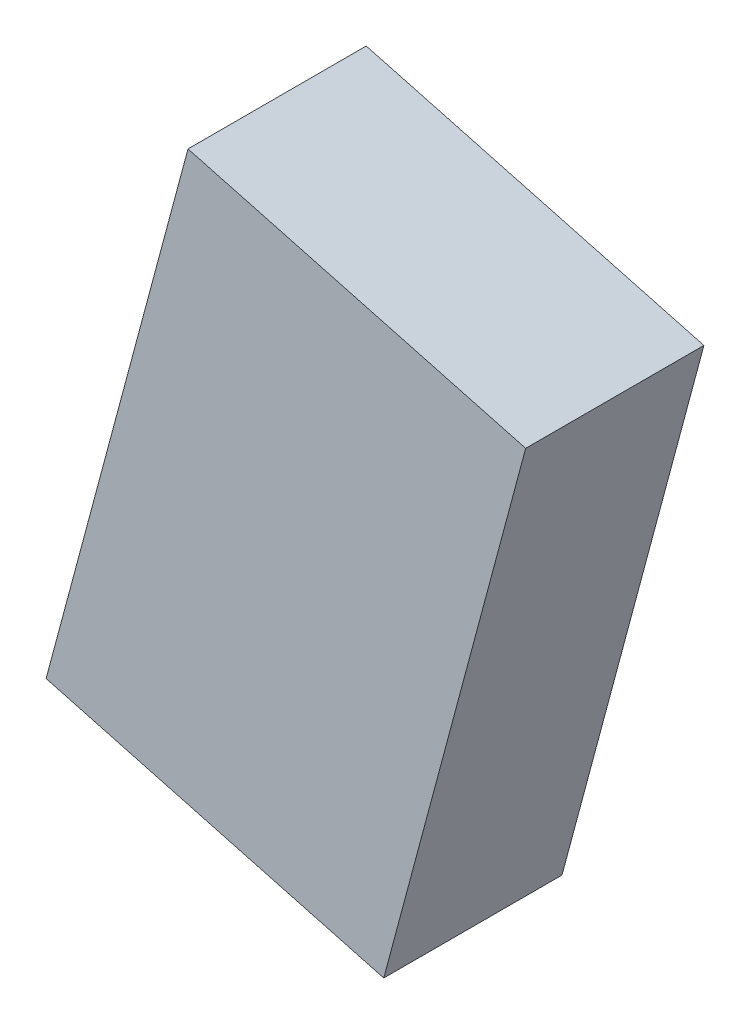
ISO-10303-21;
HEADER;
FILE_DESCRIPTION(('STEP AP214'),'2;1');
FILE_NAME('part.step','',(''),(''),'','','');
FILE_SCHEMA(('AUTOMOTIVE_DESIGN { 1 0 10303 214 1 1 1 1 }'));
ENDSEC;
DATA;
#1=APPLICATION_CONTEXT('core data for automotive mechanical design processes');
#2=APPLICATION_PROTOCOL_DEFINITION('international standard','automotive_design',2000,#1);
#3=PRODUCT_CONTEXT('',#1,'mechanical');
#4=PRODUCT('Part','Part','',(#3));
#5=PRODUCT_RELATED_PRODUCT_CATEGORY('part','',(#4));
#6=PRODUCT_DEFINITION_FORMATION('','',#4);
#7=PRODUCT_DEFINITION_CONTEXT('part definition',#1,'design');
#8=PRODUCT_DEFINITION('design','',#6,#7);
#9=PRODUCT_DEFINITION_SHAPE('','',#8);
#10=(LENGTH_UNIT() NAMED_UNIT(*) SI_UNIT(.MILLI.,.METRE.));
#11=(NAMED_UNIT(*) PLANE_ANGLE_UNIT() SI_UNIT($,.RADIAN.));
#12=(NAMED_UNIT(*) SI_UNIT($,.STERADIAN.) SOLID_ANGLE_UNIT());
#13=UNCERTAINTY_MEASURE_WITH_UNIT(LENGTH_MEASURE(1.E-05),#10,'distance_accuracy_value','');
#14=(GEOMETRIC_REPRESENTATION_CONTEXT(3) GLOBAL_UNCERTAINTY_ASSIGNED_CONTEXT((#13)) GLOBAL_UNIT_ASSIGNED_CONTEXT((#10,
#11,#12)) REPRESENTATION_CONTEXT('',''));
#15=CARTESIAN_POINT('',(0.,0.,0.));
#16=DIRECTION('',(0.,0.,1.));
#17=DIRECTION('',(1.,0.,0.));
#18=AXIS2_PLACEMENT_3D('',#15,#16,#17);
#19=CARTESIAN_POINT('',(27.726237173534,-151.4199194331,121.1));
#20=DIRECTION('',(0.,0.,1.));
#21=DIRECTION('',(1.,0.,0.));
#22=AXIS2_PLACEMENT_3D('',#19,#20,#21);
#23=PLANE('',#22);
#24=DIRECTION('',(-0.96592885755583,0.258807731995954,0.));
#25=VECTOR('',#24,1.);
#26=CARTESIAN_POINT('',(27.726237173534,-151.4199194331,121.1));
#27=LINE('',#26,#25);
#28=CARTESIAN_POINT('',(27.726237173534,-151.4199194331,121.1));
#29=VERTEX_POINT('',#28);
#30=CARTESIAN_POINT('',(17.873762826466,-148.7800805668,121.1));
#31=VERTEX_POINT('',#30);
#32=EDGE_CURVE('E72',#29,#31,#27,.T.);
#33=ORIENTED_EDGE('',*,*,#32,.F.);
#34=DIRECTION('',(0.258807731995954,0.96592885755583,0.));
#35=VECTOR('',#34,1.);
#36=CARTESIAN_POINT('',(27.726237173534,-151.4199194331,121.1));
#37=LINE('',#36,#35);
#38=CARTESIAN_POINT('',(31.867160885478,-135.9650577122,121.1));
#39=VERTEX_POINT('',#38);
#40=EDGE_CURVE('E66',#29,#39,#37,.T.);
#41=ORIENTED_EDGE('',*,*,#40,.T.);
#42=DIRECTION('',(-0.96592885755583,0.258807731995954,0.));
#43=VECTOR('',#42,1.);
#44=CARTESIAN_POINT('',(31.867160885478,-135.9650577122,121.1));
#45=LINE('',#44,#43);
#46=CARTESIAN_POINT('',(22.01468653841,-133.3252188459,121.1));
#47=VERTEX_POINT('',#46);
#48=EDGE_CURVE('E68',#39,#47,#45,.T.);
#49=ORIENTED_EDGE('',*,*,#48,.T.);
#50=DIRECTION('',(0.258807731995954,0.96592885755583,0.));
#51=VECTOR('',#50,1.);
#52=CARTESIAN_POINT('',(17.873762826466,-148.7800805668,121.1));
#53=LINE('',#52,#51);
#54=EDGE_CURVE('E10',#31,#47,#53,.T.);
#55=ORIENTED_EDGE('',*,*,#54,.F.);
#56=EDGE_LOOP('',(#33,#41,#49,#55));
#57=FACE_BOUND('',#56,.T.);
#58=ADVANCED_FACE('F15',(#57),#23,.T.);
#59=CARTESIAN_POINT('',(27.726237173534,-151.4199194331,115.9));
#60=DIRECTION('',(0.,0.,1.));
#61=DIRECTION('',(1.,0.,0.));
#62=AXIS2_PLACEMENT_3D('',#59,#60,#61);
#63=PLANE('',#62);
#64=DIRECTION('',(0.258807731995954,0.96592885755583,0.));
#65=VECTOR('',#64,1.);
#66=CARTESIAN_POINT('',(17.873762826466,-148.7800805668,115.9));
#67=LINE('',#66,#65);
#68=CARTESIAN_POINT('',(17.873762826466,-148.7800805668,115.9));
#69=VERTEX_POINT('',#68);
#70=CARTESIAN_POINT('',(22.01468653841,-133.3252188459,115.9));
#71=VERTEX_POINT('',#70);
#72=EDGE_CURVE('E26',#69,#71,#67,.T.);
#73=ORIENTED_EDGE('',*,*,#72,.T.);
#74=DIRECTION('',(-0.96592885755583,0.258807731995954,0.));
#75=VECTOR('',#74,1.);
#76=CARTESIAN_POINT('',(31.867160885478,-135.9650577122,115.9));
#77=LINE('',#76,#75);
#78=CARTESIAN_POINT('',(31.867160885478,-135.9650577122,115.9));
#79=VERTEX_POINT('',#78);
#80=EDGE_CURVE('E86',#79,#71,#77,.T.);
#81=ORIENTED_EDGE('',*,*,#80,.F.);
#82=DIRECTION('',(0.258807731995954,0.96592885755583,0.));
#83=VECTOR('',#82,1.);
#84=CARTESIAN_POINT('',(27.726237173534,-151.4199194331,115.9));
#85=LINE('',#84,#83);
#86=CARTESIAN_POINT('',(27.726237173534,-151.4199194331,115.9));
#87=VERTEX_POINT('',#86);
#88=EDGE_CURVE('E58',#87,#79,#85,.T.);
#89=ORIENTED_EDGE('',*,*,#88,.F.);
#90=DIRECTION('',(-0.96592885755583,0.258807731995954,0.));
#91=VECTOR('',#90,1.);
#92=CARTESIAN_POINT('',(27.726237173534,-151.4199194331,115.9));
#93=LINE('',#92,#91);
#94=EDGE_CURVE('E19',#87,#69,#93,.T.);
#95=ORIENTED_EDGE('',*,*,#94,.T.);
#96=EDGE_LOOP('',(#73,#81,#89,#95));
#97=FACE_BOUND('',#96,.T.);
#98=ADVANCED_FACE('F123',(#97),#63,.F.);
#99=CARTESIAN_POINT('',(17.873762826466,-148.7800805668,115.9));
#100=DIRECTION('',(-0.96592885755583,0.258807731995954,0.));
#101=DIRECTION('',(0.,0.,1.));
#102=AXIS2_PLACEMENT_3D('',#99,#100,#101);
#103=PLANE('',#102);
#104=ORIENTED_EDGE('',*,*,#72,.F.);
#105=DIRECTION('',(0.,0.,1.));
#106=VECTOR('',#105,1.);
#107=CARTESIAN_POINT('',(17.873762826466,-148.7800805668,115.9));
#108=LINE('',#107,#106);
#109=EDGE_CURVE('E95',#69,#31,#108,.T.);
#110=ORIENTED_EDGE('',*,*,#109,.T.);
#111=ORIENTED_EDGE('',*,*,#54,.T.);
#112=DIRECTION('',(0.,0.,1.));
#113=VECTOR('',#112,1.);
#114=CARTESIAN_POINT('',(22.01468653841,-133.3252188459,115.9));
#115=LINE('',#114,#113);
#116=EDGE_CURVE('E81',#71,#47,#115,.T.);
#117=ORIENTED_EDGE('',*,*,#116,.F.);
#118=EDGE_LOOP('',(#104,#110,#111,#117));
#119=FACE_BOUND('',#118,.T.);
#120=ADVANCED_FACE('F17',(#119),#103,.T.);
#121=CARTESIAN_POINT('',(27.726237173534,-151.4199194331,115.9));
#122=DIRECTION('',(-0.96592885755583,0.258807731995954,0.));
#123=DIRECTION('',(0.,0.,1.));
#124=AXIS2_PLACEMENT_3D('',#121,#122,#123);
#125=PLANE('',#124);
#126=DIRECTION('',(0.,0.,1.));
#127=VECTOR('',#126,1.);
#128=CARTESIAN_POINT('',(31.867160885478,-135.9650577122,115.9));
#129=LINE('',#128,#127);
#130=EDGE_CURVE('E80',#79,#39,#129,.T.);
#131=ORIENTED_EDGE('',*,*,#130,.T.);
#132=ORIENTED_EDGE('',*,*,#40,.F.);
#133=DIRECTION('',(0.,0.,1.));
#134=VECTOR('',#133,1.);
#135=CARTESIAN_POINT('',(27.726237173534,-151.4199194331,115.9));
#136=LINE('',#135,#134);
#137=EDGE_CURVE('E87',#87,#29,#136,.T.);
#138=ORIENTED_EDGE('',*,*,#137,.F.);
#139=ORIENTED_EDGE('',*,*,#88,.T.);
#140=EDGE_LOOP('',(#131,#132,#138,#139));
#141=FACE_BOUND('',#140,.T.);
#142=ADVANCED_FACE('F84',(#141),#125,.F.);
#143=CARTESIAN_POINT('',(31.867160885478,-135.9650577122,115.9));
#144=DIRECTION('',(0.258807731995954,0.96592885755583,0.));
#145=DIRECTION('',(0.,0.,-1.));
#146=AXIS2_PLACEMENT_3D('',#143,#144,#145);
#147=PLANE('',#146);
#148=ORIENTED_EDGE('',*,*,#130,.F.);
#149=ORIENTED_EDGE('',*,*,#80,.T.);
#150=ORIENTED_EDGE('',*,*,#116,.T.);
#151=ORIENTED_EDGE('',*,*,#48,.F.);
#152=EDGE_LOOP('',(#148,#149,#150,#151));
#153=FACE_BOUND('',#152,.T.);
#154=ADVANCED_FACE('F78',(#153),#147,.T.);
#155=CARTESIAN_POINT('',(27.726237173534,-151.4199194331,115.9));
#156=DIRECTION('',(0.258807731995954,0.96592885755583,0.));
#157=DIRECTION('',(0.,0.,-1.));
#158=AXIS2_PLACEMENT_3D('',#155,#156,#157);
#159=PLANE('',#158);
#160=ORIENTED_EDGE('',*,*,#32,.T.);
#161=ORIENTED_EDGE('',*,*,#109,.F.);
#162=ORIENTED_EDGE('',*,*,#94,.F.);
#163=ORIENTED_EDGE('',*,*,#137,.T.);
#164=EDGE_LOOP('',(#160,#161,#162,#163));
#165=FACE_BOUND('',#164,.T.);
#166=ADVANCED_FACE('F108',(#165),#159,.F.);
#167=CLOSED_SHELL('',(#58,#98,#120,#142,#154,#166));
#168=MANIFOLD_SOLID_BREP('B1',#167);
#169=ADVANCED_BREP_SHAPE_REPRESENTATION('',(#18,#168),#14);
#170=SHAPE_DEFINITION_REPRESENTATION(#9,#169);
ENDSEC;
END-ISO-10303-21;
